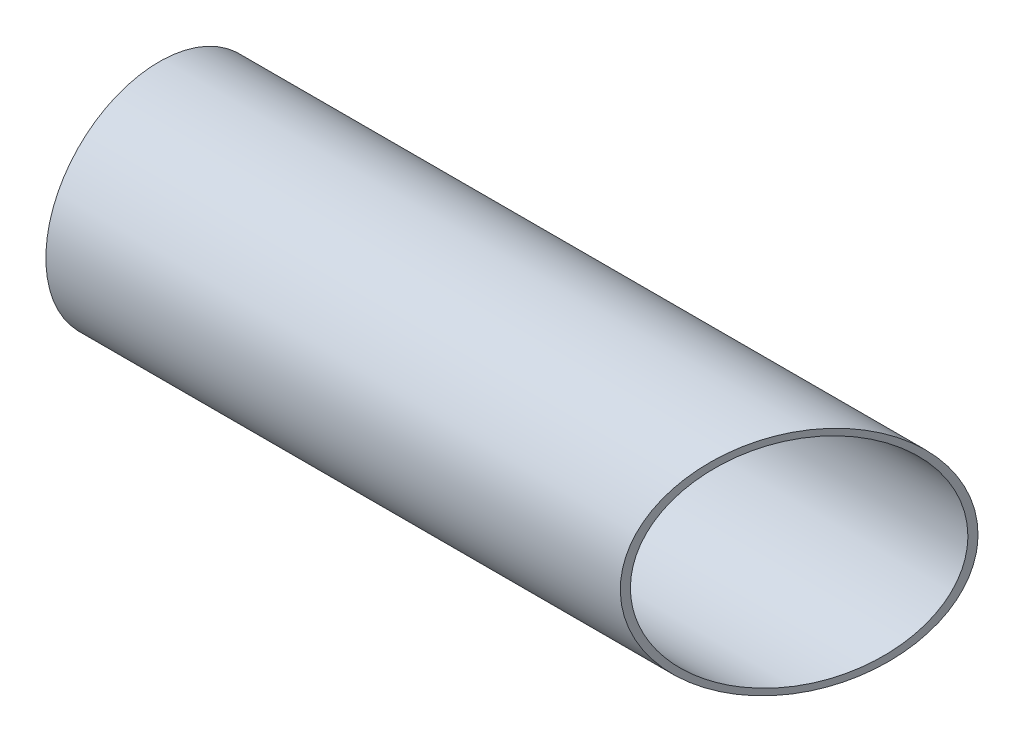
ISO-10303-21;
HEADER;
FILE_DESCRIPTION(('STEP AP214'),'2;1');
FILE_NAME('part.step','',(''),(''),'','','');
FILE_SCHEMA(('AUTOMOTIVE_DESIGN { 1 0 10303 214 1 1 1 1 }'));
ENDSEC;
DATA;
#1=APPLICATION_CONTEXT('core data for automotive mechanical design processes');
#2=APPLICATION_PROTOCOL_DEFINITION('international standard','automotive_design',2000,#1);
#3=PRODUCT_CONTEXT('',#1,'mechanical');
#4=PRODUCT('Part','Part','',(#3));
#5=PRODUCT_RELATED_PRODUCT_CATEGORY('part','',(#4));
#6=PRODUCT_DEFINITION_FORMATION('','',#4);
#7=PRODUCT_DEFINITION_CONTEXT('part definition',#1,'design');
#8=PRODUCT_DEFINITION('design','',#6,#7);
#9=PRODUCT_DEFINITION_SHAPE('','',#8);
#10=(LENGTH_UNIT() NAMED_UNIT(*) SI_UNIT(.MILLI.,.METRE.));
#11=(NAMED_UNIT(*) PLANE_ANGLE_UNIT() SI_UNIT($,.RADIAN.));
#12=(NAMED_UNIT(*) SI_UNIT($,.STERADIAN.) SOLID_ANGLE_UNIT());
#13=UNCERTAINTY_MEASURE_WITH_UNIT(LENGTH_MEASURE(1.E-05),#10,'distance_accuracy_value','');
#14=(GEOMETRIC_REPRESENTATION_CONTEXT(3) GLOBAL_UNCERTAINTY_ASSIGNED_CONTEXT((#13)) GLOBAL_UNIT_ASSIGNED_CONTEXT((#10,
#11,#12)) REPRESENTATION_CONTEXT('',''));
#15=CARTESIAN_POINT('',(0.,0.,0.));
#16=DIRECTION('',(0.,0.,1.));
#17=DIRECTION('',(1.,0.,0.));
#18=AXIS2_PLACEMENT_3D('',#15,#16,#17);
#19=CARTESIAN_POINT('',(487.5,-53.01,-844.374768689828));
#20=DIRECTION('',(-0.866025403784439,0.,-0.5));
#21=DIRECTION('',(-0.5,0.,0.866025403784439));
#22=AXIS2_PLACEMENT_3D('',#19,#20,#21);
#23=PLANE('',#22);
#24=CARTESIAN_POINT('',(404.145188432738,0.,-700.));
#25=DIRECTION('',(0.866025403784439,0.,0.5));
#26=DIRECTION('',(0.5,0.,-0.866025403784439));
#27=AXIS2_PLACEMENT_3D('',#24,#25,#26);
#28=ELLIPSE('',#27,57.7350269189626,50.);
#29=CARTESIAN_POINT('',(433.012701892219,0.,-750.));
#30=VERTEX_POINT('',#29);
#31=EDGE_CURVE('E49',#30,#30,#28,.T.);
#32=ORIENTED_EDGE('',*,*,#31,.F.);
#33=EDGE_LOOP('',(#32));
#34=FACE_BOUND('',#33,.T.);
#35=CARTESIAN_POINT('',(404.145188432738,0.,-700.));
#36=DIRECTION('',(0.866025403784439,0.,0.5));
#37=DIRECTION('',(0.5,0.,-0.866025403784439));
#38=AXIS2_PLACEMENT_3D('',#35,#36,#37);
#39=ELLIPSE('',#38,61.1991285341004,53.);
#40=CARTESIAN_POINT('',(434.744752699788,0.,-753.));
#41=VERTEX_POINT('',#40);
#42=EDGE_CURVE('E11',#41,#41,#39,.T.);
#43=ORIENTED_EDGE('',*,*,#42,.T.);
#44=EDGE_LOOP('',(#43));
#45=FACE_BOUND('',#44,.T.);
#46=ADVANCED_FACE('F36',(#34,#45),#23,.F.);
#47=CARTESIAN_POINT('',(105.045188432738,-53.01,-181.943603456149));
#48=DIRECTION('',(1.,0.,0.));
#49=DIRECTION('',(0.,0.,-1.));
#50=AXIS2_PLACEMENT_3D('',#47,#48,#49);
#51=PLANE('',#50);
#52=CARTESIAN_POINT('',(105.045188432738,0.,-700.));
#53=DIRECTION('',(1.,0.,0.));
#54=DIRECTION('',(0.,0.,-1.));
#55=AXIS2_PLACEMENT_3D('',#52,#53,#54);
#56=CIRCLE('',#55,50.);
#57=CARTESIAN_POINT('',(105.045188432738,0.,-750.));
#58=VERTEX_POINT('',#57);
#59=EDGE_CURVE('E39',#58,#58,#56,.T.);
#60=ORIENTED_EDGE('',*,*,#59,.T.);
#61=EDGE_LOOP('',(#60));
#62=FACE_BOUND('',#61,.T.);
#63=CARTESIAN_POINT('',(105.045188432738,0.,-700.));
#64=DIRECTION('',(1.,0.,0.));
#65=DIRECTION('',(0.,0.,-1.));
#66=AXIS2_PLACEMENT_3D('',#63,#64,#65);
#67=CIRCLE('',#66,53.);
#68=CARTESIAN_POINT('',(105.045188432738,0.,-753.));
#69=VERTEX_POINT('',#68);
#70=EDGE_CURVE('E47',#69,#69,#67,.T.);
#71=ORIENTED_EDGE('',*,*,#70,.F.);
#72=EDGE_LOOP('',(#71));
#73=FACE_BOUND('',#72,.T.);
#74=ADVANCED_FACE('F57',(#62,#73),#51,.F.);
#75=CARTESIAN_POINT('',(-404.145188432738,0.,-700.));
#76=DIRECTION('',(1.,0.,0.));
#77=DIRECTION('',(0.,0.,-1.));
#78=AXIS2_PLACEMENT_3D('',#75,#76,#77);
#79=CYLINDRICAL_SURFACE('',#78,53.);
#80=ORIENTED_EDGE('',*,*,#70,.T.);
#81=EDGE_LOOP('',(#80));
#82=FACE_BOUND('',#81,.T.);
#83=ORIENTED_EDGE('',*,*,#42,.F.);
#84=EDGE_LOOP('',(#83));
#85=FACE_BOUND('',#84,.T.);
#86=ADVANCED_FACE('F54',(#82,#85),#79,.T.);
#87=CARTESIAN_POINT('',(-404.145188432738,0.,-700.));
#88=DIRECTION('',(1.,0.,0.));
#89=DIRECTION('',(0.,0.,-1.));
#90=AXIS2_PLACEMENT_3D('',#87,#88,#89);
#91=CYLINDRICAL_SURFACE('',#90,50.);
#92=ORIENTED_EDGE('',*,*,#59,.F.);
#93=EDGE_LOOP('',(#92));
#94=FACE_BOUND('',#93,.T.);
#95=ORIENTED_EDGE('',*,*,#31,.T.);
#96=EDGE_LOOP('',(#95));
#97=FACE_BOUND('',#96,.T.);
#98=ADVANCED_FACE('F60',(#94,#97),#91,.F.);
#99=CLOSED_SHELL('',(#46,#74,#86,#98));
#100=MANIFOLD_SOLID_BREP('B2',#99);
#101=ADVANCED_BREP_SHAPE_REPRESENTATION('',(#18,#100),#14);
#102=SHAPE_DEFINITION_REPRESENTATION(#9,#101);
ENDSEC;
END-ISO-10303-21;
